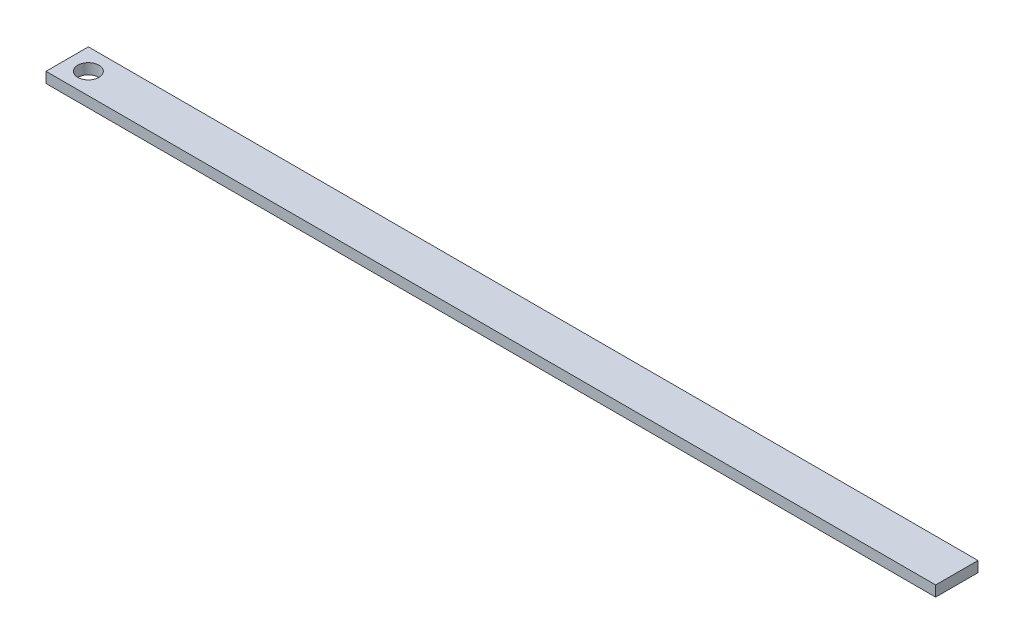
ISO-10303-21;
HEADER;
FILE_DESCRIPTION(('STEP AP214'),'2;1');
FILE_NAME('part.step','',(''),(''),'','','');
FILE_SCHEMA(('AUTOMOTIVE_DESIGN { 1 0 10303 214 1 1 1 1 }'));
ENDSEC;
DATA;
#1=APPLICATION_CONTEXT('core data for automotive mechanical design processes');
#2=APPLICATION_PROTOCOL_DEFINITION('international standard','automotive_design',2000,#1);
#3=PRODUCT_CONTEXT('',#1,'mechanical');
#4=PRODUCT('Part','Part','',(#3));
#5=PRODUCT_RELATED_PRODUCT_CATEGORY('part','',(#4));
#6=PRODUCT_DEFINITION_FORMATION('','',#4);
#7=PRODUCT_DEFINITION_CONTEXT('part definition',#1,'design');
#8=PRODUCT_DEFINITION('design','',#6,#7);
#9=PRODUCT_DEFINITION_SHAPE('','',#8);
#10=(LENGTH_UNIT() NAMED_UNIT(*) SI_UNIT(.MILLI.,.METRE.));
#11=(NAMED_UNIT(*) PLANE_ANGLE_UNIT() SI_UNIT($,.RADIAN.));
#12=(NAMED_UNIT(*) SI_UNIT($,.STERADIAN.) SOLID_ANGLE_UNIT());
#13=UNCERTAINTY_MEASURE_WITH_UNIT(LENGTH_MEASURE(1.E-05),#10,'distance_accuracy_value','');
#14=(GEOMETRIC_REPRESENTATION_CONTEXT(3) GLOBAL_UNCERTAINTY_ASSIGNED_CONTEXT((#13)) GLOBAL_UNIT_ASSIGNED_CONTEXT((#10,
#11,#12)) REPRESENTATION_CONTEXT('',''));
#15=CARTESIAN_POINT('',(0.,0.,0.));
#16=DIRECTION('',(0.,0.,1.));
#17=DIRECTION('',(1.,0.,0.));
#18=AXIS2_PLACEMENT_3D('',#15,#16,#17);
#19=CARTESIAN_POINT('',(10.5,0.25,0.499999999999996));
#20=DIRECTION('',(0.,1.,0.));
#21=DIRECTION('',(0.,0.,1.));
#22=AXIS2_PLACEMENT_3D('',#19,#20,#21);
#23=PLANE('',#22);
#24=DIRECTION('',(0.,0.,-1.));
#25=VECTOR('',#24,1.);
#26=CARTESIAN_POINT('',(10.5,0.25,-0.500000000000004));
#27=LINE('',#26,#25);
#28=CARTESIAN_POINT('',(10.5,0.25,0.499999999999996));
#29=VERTEX_POINT('',#28);
#30=CARTESIAN_POINT('',(10.5,0.25,-0.500000000000004));
#31=VERTEX_POINT('',#30);
#32=EDGE_CURVE('E89',#29,#31,#27,.T.);
#33=ORIENTED_EDGE('',*,*,#32,.T.);
#34=DIRECTION('',(-1.,0.,0.));
#35=VECTOR('',#34,1.);
#36=CARTESIAN_POINT('',(-10.5,0.25,-0.500000000000004));
#37=LINE('',#36,#35);
#38=CARTESIAN_POINT('',(-10.5,0.25,-0.500000000000004));
#39=VERTEX_POINT('',#38);
#40=EDGE_CURVE('E84',#31,#39,#37,.T.);
#41=ORIENTED_EDGE('',*,*,#40,.T.);
#42=DIRECTION('',(0.,0.,1.));
#43=VECTOR('',#42,1.);
#44=CARTESIAN_POINT('',(-10.5,0.25,-0.500000000000004));
#45=LINE('',#44,#43);
#46=CARTESIAN_POINT('',(-10.5,0.25,0.500000000000004));
#47=VERTEX_POINT('',#46);
#48=EDGE_CURVE('E87',#39,#47,#45,.T.);
#49=ORIENTED_EDGE('',*,*,#48,.T.);
#50=DIRECTION('',(1.,0.,0.));
#51=VECTOR('',#50,1.);
#52=CARTESIAN_POINT('',(-10.5,0.25,0.500000000000004));
#53=LINE('',#52,#51);
#54=EDGE_CURVE('E54',#47,#29,#53,.T.);
#55=ORIENTED_EDGE('',*,*,#54,.T.);
#56=EDGE_LOOP('',(#33,#41,#49,#55));
#57=FACE_BOUND('',#56,.T.);
#58=CARTESIAN_POINT('',(-9.99999999999999,0.25,0.));
#59=DIRECTION('',(0.,1.,0.));
#60=DIRECTION('',(0.,0.,1.));
#61=AXIS2_PLACEMENT_3D('',#58,#59,#60);
#62=CIRCLE('',#61,0.25);
#63=CARTESIAN_POINT('',(-9.99999999999999,0.25,0.25));
#64=VERTEX_POINT('',#63);
#65=EDGE_CURVE('E104',#64,#64,#62,.T.);
#66=ORIENTED_EDGE('',*,*,#65,.F.);
#67=EDGE_LOOP('',(#66));
#68=FACE_BOUND('',#67,.T.);
#69=ADVANCED_FACE('F37',(#57,#68),#23,.T.);
#70=CARTESIAN_POINT('',(10.5,0.,0.499999999999996));
#71=DIRECTION('',(0.,1.,0.));
#72=DIRECTION('',(0.,0.,1.));
#73=AXIS2_PLACEMENT_3D('',#70,#71,#72);
#74=PLANE('',#73);
#75=DIRECTION('',(0.,0.,-1.));
#76=VECTOR('',#75,1.);
#77=CARTESIAN_POINT('',(10.5,0.,-0.500000000000004));
#78=LINE('',#77,#76);
#79=CARTESIAN_POINT('',(10.5,0.,0.499999999999996));
#80=VERTEX_POINT('',#79);
#81=CARTESIAN_POINT('',(10.5,0.,-0.500000000000004));
#82=VERTEX_POINT('',#81);
#83=EDGE_CURVE('E101',#80,#82,#78,.T.);
#84=ORIENTED_EDGE('',*,*,#83,.F.);
#85=DIRECTION('',(1.,0.,0.));
#86=VECTOR('',#85,1.);
#87=CARTESIAN_POINT('',(-10.5,0.,0.500000000000004));
#88=LINE('',#87,#86);
#89=CARTESIAN_POINT('',(-10.5,0.,0.500000000000004));
#90=VERTEX_POINT('',#89);
#91=EDGE_CURVE('E77',#90,#80,#88,.T.);
#92=ORIENTED_EDGE('',*,*,#91,.F.);
#93=DIRECTION('',(0.,0.,1.));
#94=VECTOR('',#93,1.);
#95=CARTESIAN_POINT('',(-10.5,0.,-0.500000000000004));
#96=LINE('',#95,#94);
#97=CARTESIAN_POINT('',(-10.5,0.,-0.500000000000004));
#98=VERTEX_POINT('',#97);
#99=EDGE_CURVE('E71',#98,#90,#96,.T.);
#100=ORIENTED_EDGE('',*,*,#99,.F.);
#101=DIRECTION('',(-1.,0.,0.));
#102=VECTOR('',#101,1.);
#103=CARTESIAN_POINT('',(-10.5,0.,-0.500000000000004));
#104=LINE('',#103,#102);
#105=EDGE_CURVE('E93',#82,#98,#104,.T.);
#106=ORIENTED_EDGE('',*,*,#105,.F.);
#107=EDGE_LOOP('',(#84,#92,#100,#106));
#108=FACE_BOUND('',#107,.T.);
#109=CARTESIAN_POINT('',(-9.99999999999999,0.,0.));
#110=DIRECTION('',(0.,1.,0.));
#111=DIRECTION('',(0.,0.,1.));
#112=AXIS2_PLACEMENT_3D('',#109,#110,#111);
#113=CIRCLE('',#112,0.25);
#114=CARTESIAN_POINT('',(-9.99999999999999,0.,0.25));
#115=VERTEX_POINT('',#114);
#116=EDGE_CURVE('E116',#115,#115,#113,.T.);
#117=ORIENTED_EDGE('',*,*,#116,.T.);
#118=EDGE_LOOP('',(#117));
#119=FACE_BOUND('',#118,.T.);
#120=ADVANCED_FACE('F112',(#108,#119),#74,.F.);
#121=CARTESIAN_POINT('',(10.5,0.25,-0.500000000000004));
#122=DIRECTION('',(-1.,0.,0.));
#123=DIRECTION('',(0.,0.,1.));
#124=AXIS2_PLACEMENT_3D('',#121,#122,#123);
#125=PLANE('',#124);
#126=ORIENTED_EDGE('',*,*,#83,.T.);
#127=DIRECTION('',(0.,-1.,0.));
#128=VECTOR('',#127,1.);
#129=CARTESIAN_POINT('',(10.5,0.25,-0.500000000000004));
#130=LINE('',#129,#128);
#131=EDGE_CURVE('E11',#31,#82,#130,.T.);
#132=ORIENTED_EDGE('',*,*,#131,.F.);
#133=ORIENTED_EDGE('',*,*,#32,.F.);
#134=DIRECTION('',(0.,-1.,0.));
#135=VECTOR('',#134,1.);
#136=CARTESIAN_POINT('',(10.5,0.25,0.499999999999996));
#137=LINE('',#136,#135);
#138=EDGE_CURVE('E97',#29,#80,#137,.T.);
#139=ORIENTED_EDGE('',*,*,#138,.T.);
#140=EDGE_LOOP('',(#126,#132,#133,#139));
#141=FACE_BOUND('',#140,.T.);
#142=ADVANCED_FACE('F39',(#141),#125,.F.);
#143=CARTESIAN_POINT('',(-10.5,0.25,-0.500000000000004));
#144=DIRECTION('',(0.,0.,1.));
#145=DIRECTION('',(1.,0.,0.));
#146=AXIS2_PLACEMENT_3D('',#143,#144,#145);
#147=PLANE('',#146);
#148=ORIENTED_EDGE('',*,*,#105,.T.);
#149=DIRECTION('',(0.,-1.,0.));
#150=VECTOR('',#149,1.);
#151=CARTESIAN_POINT('',(-10.5,0.25,-0.500000000000004));
#152=LINE('',#151,#150);
#153=EDGE_CURVE('E46',#39,#98,#152,.T.);
#154=ORIENTED_EDGE('',*,*,#153,.F.);
#155=ORIENTED_EDGE('',*,*,#40,.F.);
#156=ORIENTED_EDGE('',*,*,#131,.T.);
#157=EDGE_LOOP('',(#148,#154,#155,#156));
#158=FACE_BOUND('',#157,.T.);
#159=ADVANCED_FACE('F92',(#158),#147,.F.);
#160=CARTESIAN_POINT('',(-10.5,0.25,-0.500000000000004));
#161=DIRECTION('',(1.,0.,0.));
#162=DIRECTION('',(0.,0.,-1.));
#163=AXIS2_PLACEMENT_3D('',#160,#161,#162);
#164=PLANE('',#163);
#165=ORIENTED_EDGE('',*,*,#99,.T.);
#166=DIRECTION('',(0.,-1.,0.));
#167=VECTOR('',#166,1.);
#168=CARTESIAN_POINT('',(-10.5,0.25,0.500000000000004));
#169=LINE('',#168,#167);
#170=EDGE_CURVE('E94',#47,#90,#169,.T.);
#171=ORIENTED_EDGE('',*,*,#170,.F.);
#172=ORIENTED_EDGE('',*,*,#48,.F.);
#173=ORIENTED_EDGE('',*,*,#153,.T.);
#174=EDGE_LOOP('',(#165,#171,#172,#173));
#175=FACE_BOUND('',#174,.T.);
#176=ADVANCED_FACE('F95',(#175),#164,.F.);
#177=CARTESIAN_POINT('',(-10.5,0.25,0.500000000000004));
#178=DIRECTION('',(0.,0.,-1.));
#179=DIRECTION('',(-1.,0.,0.));
#180=AXIS2_PLACEMENT_3D('',#177,#178,#179);
#181=PLANE('',#180);
#182=ORIENTED_EDGE('',*,*,#91,.T.);
#183=ORIENTED_EDGE('',*,*,#138,.F.);
#184=ORIENTED_EDGE('',*,*,#54,.F.);
#185=ORIENTED_EDGE('',*,*,#170,.T.);
#186=EDGE_LOOP('',(#182,#183,#184,#185));
#187=FACE_BOUND('',#186,.T.);
#188=ADVANCED_FACE('F109',(#187),#181,.F.);
#189=CARTESIAN_POINT('',(-9.99999999999999,0.25,0.));
#190=DIRECTION('',(0.,-1.,0.));
#191=DIRECTION('',(0.,0.,-1.));
#192=AXIS2_PLACEMENT_3D('',#189,#190,#191);
#193=CYLINDRICAL_SURFACE('',#192,0.25);
#194=ORIENTED_EDGE('',*,*,#65,.T.);
#195=EDGE_LOOP('',(#194));
#196=FACE_BOUND('',#195,.T.);
#197=ORIENTED_EDGE('',*,*,#116,.F.);
#198=EDGE_LOOP('',(#197));
#199=FACE_BOUND('',#198,.T.);
#200=ADVANCED_FACE('F122',(#196,#199),#193,.F.);
#201=CLOSED_SHELL('',(#69,#120,#142,#159,#176,#188,#200));
#202=MANIFOLD_SOLID_BREP('B2',#201);
#203=ADVANCED_BREP_SHAPE_REPRESENTATION('',(#18,#202),#14);
#204=SHAPE_DEFINITION_REPRESENTATION(#9,#203);
ENDSEC;
END-ISO-10303-21;
